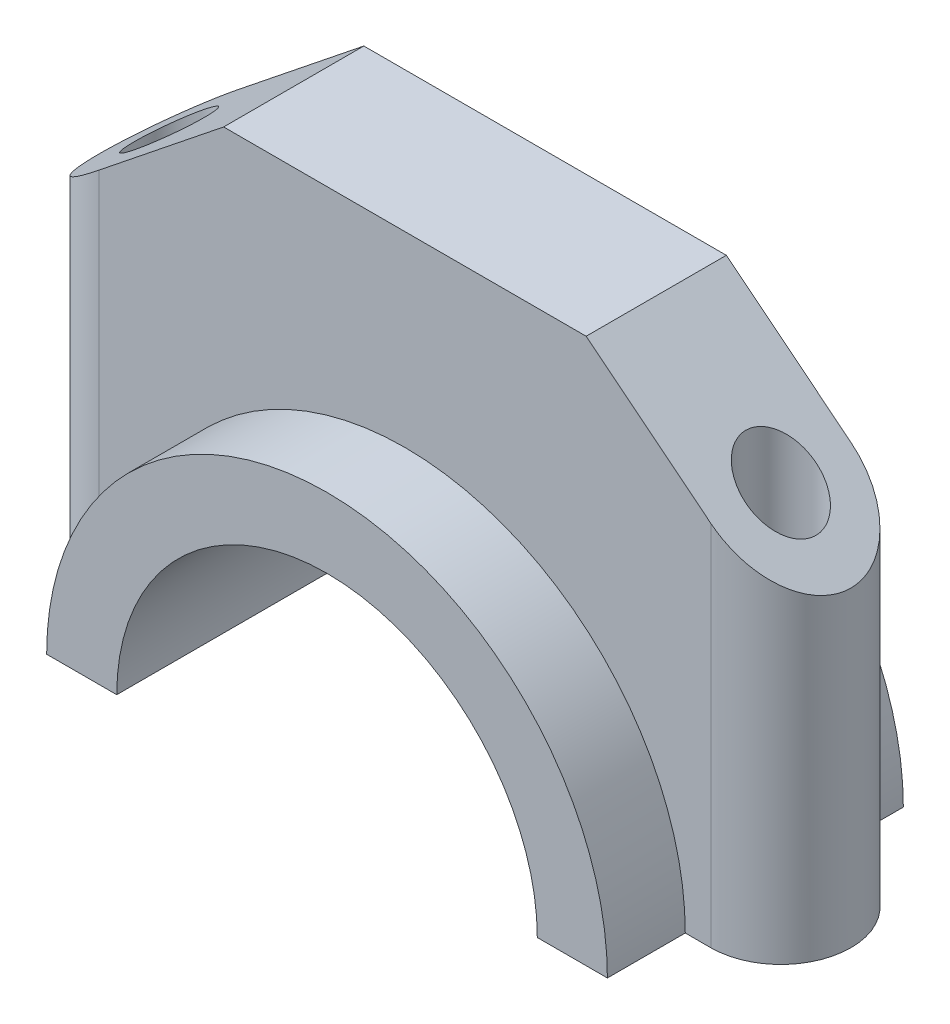
ISO-10303-21;
HEADER;
FILE_DESCRIPTION(('STEP AP214'),'2;1');
FILE_NAME('part.step','',(''),(''),'','','');
FILE_SCHEMA(('AUTOMOTIVE_DESIGN { 1 0 10303 214 1 1 1 1 }'));
ENDSEC;
DATA;
#1=APPLICATION_CONTEXT('core data for automotive mechanical design processes');
#2=APPLICATION_PROTOCOL_DEFINITION('international standard','automotive_design',2000,#1);
#3=PRODUCT_CONTEXT('',#1,'mechanical');
#4=PRODUCT('Part','Part','',(#3));
#5=PRODUCT_RELATED_PRODUCT_CATEGORY('part','',(#4));
#6=PRODUCT_DEFINITION_FORMATION('','',#4);
#7=PRODUCT_DEFINITION_CONTEXT('part definition',#1,'design');
#8=PRODUCT_DEFINITION('design','',#6,#7);
#9=PRODUCT_DEFINITION_SHAPE('','',#8);
#10=(LENGTH_UNIT() NAMED_UNIT(*) SI_UNIT(.MILLI.,.METRE.));
#11=(NAMED_UNIT(*) PLANE_ANGLE_UNIT() SI_UNIT($,.RADIAN.));
#12=(NAMED_UNIT(*) SI_UNIT($,.STERADIAN.) SOLID_ANGLE_UNIT());
#13=UNCERTAINTY_MEASURE_WITH_UNIT(LENGTH_MEASURE(1.E-05),#10,'distance_accuracy_value','');
#14=(GEOMETRIC_REPRESENTATION_CONTEXT(3) GLOBAL_UNCERTAINTY_ASSIGNED_CONTEXT((#13)) GLOBAL_UNIT_ASSIGNED_CONTEXT((#10,
#11,#12)) REPRESENTATION_CONTEXT('',''));
#15=CARTESIAN_POINT('',(0.,0.,0.));
#16=DIRECTION('',(0.,0.,1.));
#17=DIRECTION('',(1.,0.,0.));
#18=AXIS2_PLACEMENT_3D('',#15,#16,#17);
#19=CARTESIAN_POINT('',(39.2727874647283,60.,19.));
#20=DIRECTION('',(0.,-1.,0.));
#21=DIRECTION('',(0.,0.,-1.));
#22=AXIS2_PLACEMENT_3D('',#19,#20,#21);
#23=PLANE('',#22);
#24=DIRECTION('',(-1.,0.,0.));
#25=VECTOR('',#24,1.);
#26=CARTESIAN_POINT('',(39.2727874647283,60.,28.));
#27=LINE('',#26,#25);
#28=CARTESIAN_POINT('',(23.2727874647283,60.,28.));
#29=VERTEX_POINT('',#28);
#30=CARTESIAN_POINT('',(-23.2727874647283,60.,28.));
#31=VERTEX_POINT('',#30);
#32=EDGE_CURVE('E149',#29,#31,#27,.T.);
#33=ORIENTED_EDGE('',*,*,#32,.F.);
#34=DIRECTION('',(0.,0.,1.));
#35=VECTOR('',#34,1.);
#36=CARTESIAN_POINT('',(23.2727874647283,60.,-36.));
#37=LINE('',#36,#35);
#38=CARTESIAN_POINT('',(23.2727874647283,60.,10.));
#39=VERTEX_POINT('',#38);
#40=EDGE_CURVE('E134',#39,#29,#37,.T.);
#41=ORIENTED_EDGE('',*,*,#40,.F.);
#42=DIRECTION('',(1.,0.,0.));
#43=VECTOR('',#42,1.);
#44=CARTESIAN_POINT('',(39.2727874647283,60.,10.));
#45=LINE('',#44,#43);
#46=CARTESIAN_POINT('',(-23.2727874647283,60.,10.));
#47=VERTEX_POINT('',#46);
#48=EDGE_CURVE('E157',#47,#39,#45,.T.);
#49=ORIENTED_EDGE('',*,*,#48,.F.);
#50=DIRECTION('',(0.,0.,1.));
#51=VECTOR('',#50,1.);
#52=CARTESIAN_POINT('',(-23.2727874647283,60.,-36.));
#53=LINE('',#52,#51);
#54=EDGE_CURVE('E155',#47,#31,#53,.T.);
#55=ORIENTED_EDGE('',*,*,#54,.T.);
#56=EDGE_LOOP('',(#33,#41,#49,#55));
#57=FACE_BOUND('',#56,.T.);
#58=ADVANCED_FACE('F41',(#57),#23,.F.);
#59=CARTESIAN_POINT('',(39.2727874647283,-98.2092054669994,10.));
#60=DIRECTION('',(0.,0.,1.));
#61=DIRECTION('',(1.,0.,0.));
#62=AXIS2_PLACEMENT_3D('',#59,#60,#61);
#63=PLANE('',#62);
#64=ORIENTED_EDGE('',*,*,#48,.T.);
#65=DIRECTION('',(0.78086880944303,-0.624695047554424,0.));
#66=VECTOR('',#65,1.);
#67=CARTESIAN_POINT('',(110.204107204728,-9.54505579199974,10.));
#68=LINE('',#67,#66);
#69=CARTESIAN_POINT('',(39.2727874647283,47.2,10.));
#70=VERTEX_POINT('',#69);
#71=EDGE_CURVE('E140',#39,#70,#68,.T.);
#72=ORIENTED_EDGE('',*,*,#71,.T.);
#73=DIRECTION('',(0.,1.,0.));
#74=VECTOR('',#73,1.);
#75=CARTESIAN_POINT('',(39.2727874647283,-98.2092054669994,10.));
#76=LINE('',#75,#74);
#77=CARTESIAN_POINT('',(39.2727874647283,0.,10.));
#78=VERTEX_POINT('',#77);
#79=EDGE_CURVE('E162',#78,#70,#76,.T.);
#80=ORIENTED_EDGE('',*,*,#79,.F.);
#81=DIRECTION('',(-1.,0.,0.));
#82=VECTOR('',#81,1.);
#83=CARTESIAN_POINT('',(39.2727874647283,0.,10.));
#84=LINE('',#83,#82);
#85=CARTESIAN_POINT('',(36.,0.,10.));
#86=VERTEX_POINT('',#85);
#87=EDGE_CURVE('E184',#78,#86,#84,.T.);
#88=ORIENTED_EDGE('',*,*,#87,.T.);
#89=CARTESIAN_POINT('',(0.,0.,10.));
#90=DIRECTION('',(0.,0.,1.));
#91=DIRECTION('',(1.,0.,0.));
#92=AXIS2_PLACEMENT_3D('',#89,#90,#91);
#93=CIRCLE('',#92,36.);
#94=CARTESIAN_POINT('',(-36.,0.,10.));
#95=VERTEX_POINT('',#94);
#96=EDGE_CURVE('E191',#86,#95,#93,.T.);
#97=ORIENTED_EDGE('',*,*,#96,.T.);
#98=CARTESIAN_POINT('',(-39.2727874647283,0.,10.));
#99=VERTEX_POINT('',#98);
#100=EDGE_CURVE('E67',#95,#99,#84,.T.);
#101=ORIENTED_EDGE('',*,*,#100,.T.);
#102=DIRECTION('',(0.,1.,0.));
#103=VECTOR('',#102,1.);
#104=CARTESIAN_POINT('',(-39.2727874647283,-98.2092054669994,10.));
#105=LINE('',#104,#103);
#106=CARTESIAN_POINT('',(-39.2727874647283,47.2,10.));
#107=VERTEX_POINT('',#106);
#108=EDGE_CURVE('E174',#99,#107,#105,.T.);
#109=ORIENTED_EDGE('',*,*,#108,.T.);
#110=DIRECTION('',(-0.78086880944303,-0.624695047554424,0.));
#111=VECTOR('',#110,1.);
#112=CARTESIAN_POINT('',(-62.3104639550593,28.7698588077351,10.));
#113=LINE('',#112,#111);
#114=EDGE_CURVE('E236',#47,#107,#113,.T.);
#115=ORIENTED_EDGE('',*,*,#114,.F.);
#116=EDGE_LOOP('',(#64,#72,#80,#88,#97,#101,#109,#115));
#117=FACE_BOUND('',#116,.T.);
#118=ADVANCED_FACE('F302',(#117),#63,.F.);
#119=CARTESIAN_POINT('',(-39.2727874647283,-98.2092054669994,19.));
#120=DIRECTION('',(0.,1.,0.));
#121=DIRECTION('',(0.,0.,1.));
#122=AXIS2_PLACEMENT_3D('',#119,#120,#121);
#123=CYLINDRICAL_SURFACE('',#122,9.);
#124=DIRECTION('',(0.,1.,0.));
#125=VECTOR('',#124,1.);
#126=CARTESIAN_POINT('',(-39.2727874647283,-98.2092054669994,28.));
#127=LINE('',#126,#125);
#128=CARTESIAN_POINT('',(-39.2727874647283,0.,28.));
#129=VERTEX_POINT('',#128);
#130=CARTESIAN_POINT('',(-39.2727874647283,47.2,28.));
#131=VERTEX_POINT('',#130);
#132=EDGE_CURVE('E178',#129,#131,#127,.T.);
#133=ORIENTED_EDGE('',*,*,#132,.T.);
#134=CARTESIAN_POINT('',(-39.2727874647283,47.2,19.));
#135=DIRECTION('',(-0.624695047554424,0.78086880944303,0.));
#136=DIRECTION('',(0.78086880944303,0.624695047554424,0.));
#137=AXIS2_PLACEMENT_3D('',#134,#135,#136);
#138=ELLIPSE('',#137,11.5256236273791,9.);
#139=EDGE_CURVE('E59',#107,#131,#138,.T.);
#140=ORIENTED_EDGE('',*,*,#139,.F.);
#141=ORIENTED_EDGE('',*,*,#108,.F.);
#142=CARTESIAN_POINT('',(-39.2727874647283,0.,19.));
#143=DIRECTION('',(0.,1.,0.));
#144=DIRECTION('',(0.,0.,1.));
#145=AXIS2_PLACEMENT_3D('',#142,#143,#144);
#146=CIRCLE('',#145,9.);
#147=EDGE_CURVE('E187',#99,#129,#146,.T.);
#148=ORIENTED_EDGE('',*,*,#147,.T.);
#149=EDGE_LOOP('',(#133,#140,#141,#148));
#150=FACE_BOUND('',#149,.T.);
#151=ADVANCED_FACE('F307',(#150),#123,.T.);
#152=CARTESIAN_POINT('',(39.2727874647283,-98.2092054669994,28.));
#153=DIRECTION('',(0.,0.,-1.));
#154=DIRECTION('',(-1.,0.,0.));
#155=AXIS2_PLACEMENT_3D('',#152,#153,#154);
#156=PLANE('',#155);
#157=DIRECTION('',(0.,1.,0.));
#158=VECTOR('',#157,1.);
#159=CARTESIAN_POINT('',(39.2727874647283,-98.2092054669994,28.));
#160=LINE('',#159,#158);
#161=CARTESIAN_POINT('',(39.2727874647283,0.,28.));
#162=VERTEX_POINT('',#161);
#163=CARTESIAN_POINT('',(39.2727874647283,47.2,28.));
#164=VERTEX_POINT('',#163);
#165=EDGE_CURVE('E151',#162,#164,#160,.T.);
#166=ORIENTED_EDGE('',*,*,#165,.T.);
#167=DIRECTION('',(0.78086880944303,-0.624695047554424,0.));
#168=VECTOR('',#167,1.);
#169=CARTESIAN_POINT('',(38.3503560837964,47.9379451047455,28.));
#170=LINE('',#169,#168);
#171=EDGE_CURVE('E137',#29,#164,#170,.T.);
#172=ORIENTED_EDGE('',*,*,#171,.F.);
#173=ORIENTED_EDGE('',*,*,#32,.T.);
#174=DIRECTION('',(-0.78086880944303,-0.624695047554424,0.));
#175=VECTOR('',#174,1.);
#176=CARTESIAN_POINT('',(-38.3503560837964,47.9379451047455,28.));
#177=LINE('',#176,#175);
#178=EDGE_CURVE('E238',#31,#131,#177,.T.);
#179=ORIENTED_EDGE('',*,*,#178,.T.);
#180=ORIENTED_EDGE('',*,*,#132,.F.);
#181=DIRECTION('',(1.,0.,0.));
#182=VECTOR('',#181,1.);
#183=CARTESIAN_POINT('',(39.2727874647283,0.,28.));
#184=LINE('',#183,#182);
#185=CARTESIAN_POINT('',(-36.,0.,28.));
#186=VERTEX_POINT('',#185);
#187=EDGE_CURVE('E252',#129,#186,#184,.T.);
#188=ORIENTED_EDGE('',*,*,#187,.T.);
#189=CARTESIAN_POINT('',(0.,0.,28.));
#190=DIRECTION('',(0.,0.,-1.));
#191=DIRECTION('',(-1.,0.,0.));
#192=AXIS2_PLACEMENT_3D('',#189,#190,#191);
#193=CIRCLE('',#192,36.);
#194=CARTESIAN_POINT('',(36.,0.,28.));
#195=VERTEX_POINT('',#194);
#196=EDGE_CURVE('E188',#186,#195,#193,.T.);
#197=ORIENTED_EDGE('',*,*,#196,.T.);
#198=EDGE_CURVE('E251',#195,#162,#184,.T.);
#199=ORIENTED_EDGE('',*,*,#198,.T.);
#200=EDGE_LOOP('',(#166,#172,#173,#179,#180,#188,#197,#199));
#201=FACE_BOUND('',#200,.T.);
#202=ADVANCED_FACE('F148',(#201),#156,.F.);
#203=CARTESIAN_POINT('',(-39.2727874647283,-4.00000000000002,19.));
#204=DIRECTION('',(0.,1.,0.));
#205=DIRECTION('',(0.,0.,1.));
#206=AXIS2_PLACEMENT_3D('',#203,#204,#205);
#207=CYLINDRICAL_SURFACE('',#206,4.5);
#208=CARTESIAN_POINT('',(-39.2727874647283,0.,19.));
#209=DIRECTION('',(0.,1.,0.));
#210=DIRECTION('',(0.,0.,1.));
#211=AXIS2_PLACEMENT_3D('',#208,#209,#210);
#212=CIRCLE('',#211,4.5);
#213=CARTESIAN_POINT('',(-39.2727874647283,0.,23.5));
#214=VERTEX_POINT('',#213);
#215=EDGE_CURVE('E158',#214,#214,#212,.T.);
#216=ORIENTED_EDGE('',*,*,#215,.F.);
#217=EDGE_LOOP('',(#216));
#218=FACE_BOUND('',#217,.T.);
#219=CARTESIAN_POINT('',(-39.2727874647283,47.2,19.));
#220=DIRECTION('',(-0.624695047554424,0.78086880944303,0.));
#221=DIRECTION('',(0.78086880944303,0.624695047554424,0.));
#222=AXIS2_PLACEMENT_3D('',#219,#220,#221);
#223=ELLIPSE('',#222,5.76281181368956,4.5);
#224=CARTESIAN_POINT('',(-34.7727874647283,50.8,19.));
#225=VERTEX_POINT('',#224);
#226=EDGE_CURVE('E229',#225,#225,#223,.F.);
#227=ORIENTED_EDGE('',*,*,#226,.F.);
#228=EDGE_LOOP('',(#227));
#229=FACE_BOUND('',#228,.T.);
#230=ADVANCED_FACE('F299',(#218,#229),#207,.F.);
#231=CARTESIAN_POINT('',(0.,0.,38.));
#232=DIRECTION('',(0.,1.,0.));
#233=DIRECTION('',(0.,0.,1.));
#234=AXIS2_PLACEMENT_3D('',#231,#232,#233);
#235=PLANE('',#234);
#236=ORIENTED_EDGE('',*,*,#215,.T.);
#237=EDGE_LOOP('',(#236));
#238=FACE_BOUND('',#237,.T.);
#239=DIRECTION('',(1.,0.,0.));
#240=VECTOR('',#239,1.);
#241=CARTESIAN_POINT('',(0.,0.,0.));
#242=LINE('',#241,#240);
#243=CARTESIAN_POINT('',(-36.,0.,0.));
#244=VERTEX_POINT('',#243);
#245=CARTESIAN_POINT('',(-27.,0.,0.));
#246=VERTEX_POINT('',#245);
#247=EDGE_CURVE('E213',#244,#246,#242,.T.);
#248=ORIENTED_EDGE('',*,*,#247,.T.);
#249=DIRECTION('',(0.,0.,-1.));
#250=VECTOR('',#249,1.);
#251=CARTESIAN_POINT('',(-27.,0.,38.));
#252=LINE('',#251,#250);
#253=CARTESIAN_POINT('',(-27.,0.,38.));
#254=VERTEX_POINT('',#253);
#255=EDGE_CURVE('E222',#254,#246,#252,.T.);
#256=ORIENTED_EDGE('',*,*,#255,.F.);
#257=DIRECTION('',(1.,0.,0.));
#258=VECTOR('',#257,1.);
#259=CARTESIAN_POINT('',(0.,0.,38.));
#260=LINE('',#259,#258);
#261=CARTESIAN_POINT('',(-36.,0.,38.));
#262=VERTEX_POINT('',#261);
#263=EDGE_CURVE('E201',#262,#254,#260,.T.);
#264=ORIENTED_EDGE('',*,*,#263,.F.);
#265=DIRECTION('',(0.,0.,-1.));
#266=VECTOR('',#265,1.);
#267=CARTESIAN_POINT('',(-36.,0.,38.));
#268=LINE('',#267,#266);
#269=EDGE_CURVE('E226',#262,#186,#268,.T.);
#270=ORIENTED_EDGE('',*,*,#269,.T.);
#271=ORIENTED_EDGE('',*,*,#187,.F.);
#272=ORIENTED_EDGE('',*,*,#147,.F.);
#273=ORIENTED_EDGE('',*,*,#100,.F.);
#274=EDGE_CURVE('E225',#95,#244,#268,.T.);
#275=ORIENTED_EDGE('',*,*,#274,.T.);
#276=EDGE_LOOP('',(#248,#256,#264,#270,#271,#272,#273,#275));
#277=FACE_BOUND('',#276,.T.);
#278=ADVANCED_FACE('F287',(#238,#277),#235,.F.);
#279=CARTESIAN_POINT('',(0.,0.,38.));
#280=DIRECTION('',(0.,0.,-1.));
#281=DIRECTION('',(-1.,0.,0.));
#282=AXIS2_PLACEMENT_3D('',#279,#280,#281);
#283=CYLINDRICAL_SURFACE('',#282,36.);
#284=ORIENTED_EDGE('',*,*,#96,.F.);
#285=DIRECTION('',(0.,0.,-1.));
#286=VECTOR('',#285,1.);
#287=CARTESIAN_POINT('',(36.,0.,38.));
#288=LINE('',#287,#286);
#289=CARTESIAN_POINT('',(36.,0.,0.));
#290=VERTEX_POINT('',#289);
#291=EDGE_CURVE('E51',#86,#290,#288,.T.);
#292=ORIENTED_EDGE('',*,*,#291,.T.);
#293=CARTESIAN_POINT('',(0.,0.,0.));
#294=DIRECTION('',(0.,0.,1.));
#295=DIRECTION('',(1.,0.,0.));
#296=AXIS2_PLACEMENT_3D('',#293,#294,#295);
#297=CIRCLE('',#296,36.);
#298=EDGE_CURVE('E212',#290,#244,#297,.T.);
#299=ORIENTED_EDGE('',*,*,#298,.T.);
#300=ORIENTED_EDGE('',*,*,#274,.F.);
#301=EDGE_LOOP('',(#284,#292,#299,#300));
#302=FACE_BOUND('',#301,.T.);
#303=ADVANCED_FACE('F43',(#302),#283,.T.);
#304=ORIENTED_EDGE('',*,*,#196,.F.);
#305=ORIENTED_EDGE('',*,*,#269,.F.);
#306=CARTESIAN_POINT('',(0.,0.,38.));
#307=DIRECTION('',(0.,0.,1.));
#308=DIRECTION('',(1.,0.,0.));
#309=AXIS2_PLACEMENT_3D('',#306,#307,#308);
#310=CIRCLE('',#309,36.);
#311=CARTESIAN_POINT('',(36.,0.,38.));
#312=VERTEX_POINT('',#311);
#313=EDGE_CURVE('E199',#312,#262,#310,.T.);
#314=ORIENTED_EDGE('',*,*,#313,.F.);
#315=EDGE_CURVE('E11',#312,#195,#288,.T.);
#316=ORIENTED_EDGE('',*,*,#315,.T.);
#317=EDGE_LOOP('',(#304,#305,#314,#316));
#318=FACE_BOUND('',#317,.T.);
#319=ADVANCED_FACE('F295',(#318),#283,.T.);
#320=CARTESIAN_POINT('',(0.,0.,38.));
#321=DIRECTION('',(0.,0.,-1.));
#322=DIRECTION('',(-1.,0.,0.));
#323=AXIS2_PLACEMENT_3D('',#320,#321,#322);
#324=CYLINDRICAL_SURFACE('',#323,27.);
#325=ORIENTED_EDGE('',*,*,#255,.T.);
#326=CARTESIAN_POINT('',(0.,0.,0.));
#327=DIRECTION('',(0.,0.,1.));
#328=DIRECTION('',(1.,0.,0.));
#329=AXIS2_PLACEMENT_3D('',#326,#327,#328);
#330=CIRCLE('',#329,27.);
#331=CARTESIAN_POINT('',(27.,0.,0.));
#332=VERTEX_POINT('',#331);
#333=EDGE_CURVE('E200',#332,#246,#330,.T.);
#334=ORIENTED_EDGE('',*,*,#333,.F.);
#335=DIRECTION('',(0.,0.,-1.));
#336=VECTOR('',#335,1.);
#337=CARTESIAN_POINT('',(27.,0.,38.));
#338=LINE('',#337,#336);
#339=CARTESIAN_POINT('',(27.,0.,38.));
#340=VERTEX_POINT('',#339);
#341=EDGE_CURVE('E208',#340,#332,#338,.T.);
#342=ORIENTED_EDGE('',*,*,#341,.F.);
#343=CARTESIAN_POINT('',(0.,0.,38.));
#344=DIRECTION('',(0.,0.,1.));
#345=DIRECTION('',(1.,0.,0.));
#346=AXIS2_PLACEMENT_3D('',#343,#344,#345);
#347=CIRCLE('',#346,27.);
#348=EDGE_CURVE('E204',#340,#254,#347,.T.);
#349=ORIENTED_EDGE('',*,*,#348,.T.);
#350=EDGE_LOOP('',(#325,#334,#342,#349));
#351=FACE_BOUND('',#350,.T.);
#352=ADVANCED_FACE('F286',(#351),#324,.F.);
#353=CARTESIAN_POINT('',(39.2727874647283,0.,19.));
#354=DIRECTION('',(0.,1.,0.));
#355=DIRECTION('',(0.,0.,1.));
#356=AXIS2_PLACEMENT_3D('',#353,#354,#355);
#357=CIRCLE('',#356,4.5);
#358=CARTESIAN_POINT('',(39.2727874647283,0.,23.5));
#359=VERTEX_POINT('',#358);
#360=EDGE_CURVE('E165',#359,#359,#357,.F.);
#361=ORIENTED_EDGE('',*,*,#360,.F.);
#362=EDGE_LOOP('',(#361));
#363=FACE_BOUND('',#362,.T.);
#364=ORIENTED_EDGE('',*,*,#341,.T.);
#365=EDGE_CURVE('E194',#332,#290,#242,.T.);
#366=ORIENTED_EDGE('',*,*,#365,.T.);
#367=ORIENTED_EDGE('',*,*,#291,.F.);
#368=ORIENTED_EDGE('',*,*,#87,.F.);
#369=CARTESIAN_POINT('',(39.2727874647283,0.,19.));
#370=DIRECTION('',(0.,1.,0.));
#371=DIRECTION('',(0.,0.,1.));
#372=AXIS2_PLACEMENT_3D('',#369,#370,#371);
#373=CIRCLE('',#372,9.);
#374=EDGE_CURVE('E168',#162,#78,#373,.T.);
#375=ORIENTED_EDGE('',*,*,#374,.F.);
#376=ORIENTED_EDGE('',*,*,#198,.F.);
#377=ORIENTED_EDGE('',*,*,#315,.F.);
#378=EDGE_CURVE('E195',#340,#312,#260,.T.);
#379=ORIENTED_EDGE('',*,*,#378,.F.);
#380=EDGE_LOOP('',(#364,#366,#367,#368,#375,#376,#377,#379));
#381=FACE_BOUND('',#380,.T.);
#382=ADVANCED_FACE('F263',(#363,#381),#235,.F.);
#383=CARTESIAN_POINT('',(0.,0.,38.));
#384=DIRECTION('',(0.,0.,1.));
#385=DIRECTION('',(1.,0.,0.));
#386=AXIS2_PLACEMENT_3D('',#383,#384,#385);
#387=PLANE('',#386);
#388=ORIENTED_EDGE('',*,*,#378,.T.);
#389=ORIENTED_EDGE('',*,*,#313,.T.);
#390=ORIENTED_EDGE('',*,*,#263,.T.);
#391=ORIENTED_EDGE('',*,*,#348,.F.);
#392=EDGE_LOOP('',(#388,#389,#390,#391));
#393=FACE_BOUND('',#392,.T.);
#394=ADVANCED_FACE('F285',(#393),#387,.T.);
#395=CARTESIAN_POINT('',(0.,0.,0.));
#396=DIRECTION('',(0.,0.,1.));
#397=DIRECTION('',(1.,0.,0.));
#398=AXIS2_PLACEMENT_3D('',#395,#396,#397);
#399=PLANE('',#398);
#400=ORIENTED_EDGE('',*,*,#365,.F.);
#401=ORIENTED_EDGE('',*,*,#333,.T.);
#402=ORIENTED_EDGE('',*,*,#247,.F.);
#403=ORIENTED_EDGE('',*,*,#298,.F.);
#404=EDGE_LOOP('',(#400,#401,#402,#403));
#405=FACE_BOUND('',#404,.T.);
#406=ADVANCED_FACE('F292',(#405),#399,.F.);
#407=CARTESIAN_POINT('',(39.2727874647283,-98.2092054669994,19.));
#408=DIRECTION('',(0.,1.,0.));
#409=DIRECTION('',(0.,0.,1.));
#410=AXIS2_PLACEMENT_3D('',#407,#408,#409);
#411=CYLINDRICAL_SURFACE('',#410,9.);
#412=CARTESIAN_POINT('',(39.2727874647283,47.2,19.));
#413=DIRECTION('',(-0.624695047554424,-0.78086880944303,0.));
#414=DIRECTION('',(-0.78086880944303,0.624695047554424,0.));
#415=AXIS2_PLACEMENT_3D('',#412,#413,#414);
#416=ELLIPSE('',#415,11.5256236273791,9.);
#417=EDGE_CURVE('E268',#70,#164,#416,.T.);
#418=ORIENTED_EDGE('',*,*,#417,.T.);
#419=ORIENTED_EDGE('',*,*,#165,.F.);
#420=ORIENTED_EDGE('',*,*,#374,.T.);
#421=ORIENTED_EDGE('',*,*,#79,.T.);
#422=EDGE_LOOP('',(#418,#419,#420,#421));
#423=FACE_BOUND('',#422,.T.);
#424=ADVANCED_FACE('F267',(#423),#411,.T.);
#425=CARTESIAN_POINT('',(39.2727874647283,-4.00000000000002,19.));
#426=DIRECTION('',(0.,1.,0.));
#427=DIRECTION('',(0.,0.,1.));
#428=AXIS2_PLACEMENT_3D('',#425,#426,#427);
#429=CYLINDRICAL_SURFACE('',#428,4.5);
#430=CARTESIAN_POINT('',(39.2727874647283,47.2,19.));
#431=DIRECTION('',(-0.624695047554424,-0.78086880944303,0.));
#432=DIRECTION('',(-0.78086880944303,0.624695047554424,0.));
#433=AXIS2_PLACEMENT_3D('',#430,#431,#432);
#434=ELLIPSE('',#433,5.76281181368956,4.5);
#435=CARTESIAN_POINT('',(34.7727874647283,50.8,19.));
#436=VERTEX_POINT('',#435);
#437=EDGE_CURVE('E45',#436,#436,#434,.T.);
#438=ORIENTED_EDGE('',*,*,#437,.F.);
#439=EDGE_LOOP('',(#438));
#440=FACE_BOUND('',#439,.T.);
#441=ORIENTED_EDGE('',*,*,#360,.T.);
#442=EDGE_LOOP('',(#441));
#443=FACE_BOUND('',#442,.T.);
#444=ADVANCED_FACE('F277',(#440,#443),#429,.F.);
#445=CARTESIAN_POINT('',(-38.3503560837964,47.9379451047455,-36.));
#446=DIRECTION('',(-0.624695047554424,0.78086880944303,0.));
#447=DIRECTION('',(-0.78086880944303,-0.624695047554424,0.));
#448=AXIS2_PLACEMENT_3D('',#445,#446,#447);
#449=PLANE('',#448);
#450=ORIENTED_EDGE('',*,*,#226,.T.);
#451=EDGE_LOOP('',(#450));
#452=FACE_BOUND('',#451,.T.);
#453=ORIENTED_EDGE('',*,*,#114,.T.);
#454=ORIENTED_EDGE('',*,*,#139,.T.);
#455=ORIENTED_EDGE('',*,*,#178,.F.);
#456=ORIENTED_EDGE('',*,*,#54,.F.);
#457=EDGE_LOOP('',(#453,#454,#455,#456));
#458=FACE_BOUND('',#457,.T.);
#459=ADVANCED_FACE('F280',(#452,#458),#449,.T.);
#460=CARTESIAN_POINT('',(38.3503560837964,47.9379451047455,-36.));
#461=DIRECTION('',(-0.624695047554424,-0.78086880944303,0.));
#462=DIRECTION('',(0.78086880944303,-0.624695047554424,0.));
#463=AXIS2_PLACEMENT_3D('',#460,#461,#462);
#464=PLANE('',#463);
#465=ORIENTED_EDGE('',*,*,#437,.T.);
#466=EDGE_LOOP('',(#465));
#467=FACE_BOUND('',#466,.T.);
#468=ORIENTED_EDGE('',*,*,#40,.T.);
#469=ORIENTED_EDGE('',*,*,#171,.T.);
#470=ORIENTED_EDGE('',*,*,#417,.F.);
#471=ORIENTED_EDGE('',*,*,#71,.F.);
#472=EDGE_LOOP('',(#468,#469,#470,#471));
#473=FACE_BOUND('',#472,.T.);
#474=ADVANCED_FACE('F136',(#467,#473),#464,.F.);
#475=CLOSED_SHELL('',(#58,#118,#151,#202,#230,#278,#303,#319,#352,#382,#394,#406,#424,#444,#459,#474));
#476=MANIFOLD_SOLID_BREP('B2',#475);
#477=ADVANCED_BREP_SHAPE_REPRESENTATION('',(#18,#476),#14);
#478=SHAPE_DEFINITION_REPRESENTATION(#9,#477);
ENDSEC;
END-ISO-10303-21;
